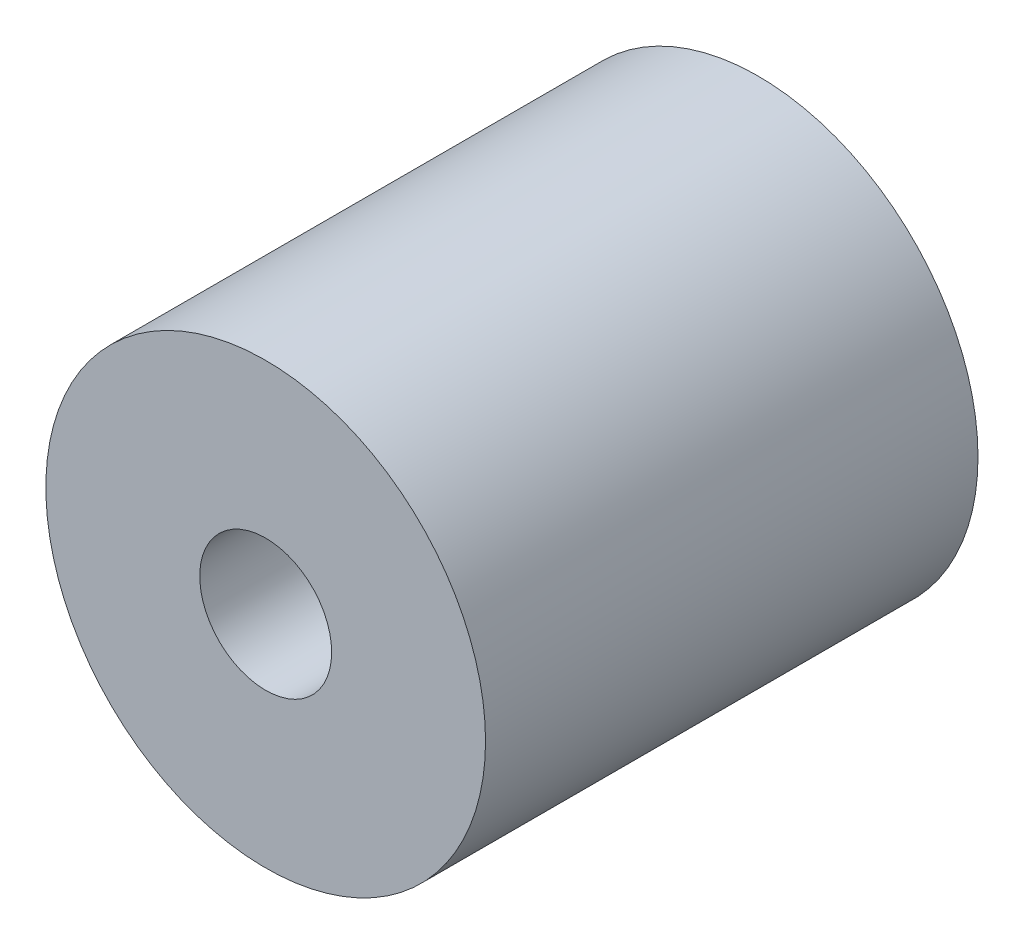
ISO-10303-21;
HEADER;
FILE_DESCRIPTION(('STEP AP214'),'2;1');
FILE_NAME('part.step','',(''),(''),'','','');
FILE_SCHEMA(('AUTOMOTIVE_DESIGN { 1 0 10303 214 1 1 1 1 }'));
ENDSEC;
DATA;
#1=APPLICATION_CONTEXT('core data for automotive mechanical design processes');
#2=APPLICATION_PROTOCOL_DEFINITION('international standard','automotive_design',2000,#1);
#3=PRODUCT_CONTEXT('',#1,'mechanical');
#4=PRODUCT('Part','Part','',(#3));
#5=PRODUCT_RELATED_PRODUCT_CATEGORY('part','',(#4));
#6=PRODUCT_DEFINITION_FORMATION('','',#4);
#7=PRODUCT_DEFINITION_CONTEXT('part definition',#1,'design');
#8=PRODUCT_DEFINITION('design','',#6,#7);
#9=PRODUCT_DEFINITION_SHAPE('','',#8);
#10=(LENGTH_UNIT() NAMED_UNIT(*) SI_UNIT(.MILLI.,.METRE.));
#11=(NAMED_UNIT(*) PLANE_ANGLE_UNIT() SI_UNIT($,.RADIAN.));
#12=(NAMED_UNIT(*) SI_UNIT($,.STERADIAN.) SOLID_ANGLE_UNIT());
#13=UNCERTAINTY_MEASURE_WITH_UNIT(LENGTH_MEASURE(1.E-05),#10,'distance_accuracy_value','');
#14=(GEOMETRIC_REPRESENTATION_CONTEXT(3) GLOBAL_UNCERTAINTY_ASSIGNED_CONTEXT((#13)) GLOBAL_UNIT_ASSIGNED_CONTEXT((#10,
#11,#12)) REPRESENTATION_CONTEXT('',''));
#15=CARTESIAN_POINT('',(0.,0.,0.));
#16=DIRECTION('',(0.,0.,1.));
#17=DIRECTION('',(1.,0.,0.));
#18=AXIS2_PLACEMENT_3D('',#15,#16,#17);
#19=CARTESIAN_POINT('',(0.,0.,17.78));
#20=DIRECTION('',(0.,0.,1.));
#21=DIRECTION('',(1.,0.,0.));
#22=AXIS2_PLACEMENT_3D('',#19,#20,#21);
#23=PLANE('',#22);
#24=CARTESIAN_POINT('',(0.,0.,17.78));
#25=DIRECTION('',(0.,0.,1.));
#26=DIRECTION('',(1.,0.,0.));
#27=AXIS2_PLACEMENT_3D('',#24,#25,#26);
#28=CIRCLE('',#27,7.9375);
#29=CARTESIAN_POINT('',(7.9375,0.,17.78));
#30=VERTEX_POINT('',#29);
#31=EDGE_CURVE('E10',#30,#30,#28,.T.);
#32=ORIENTED_EDGE('',*,*,#31,.T.);
#33=EDGE_LOOP('',(#32));
#34=FACE_BOUND('',#33,.T.);
#35=CARTESIAN_POINT('',(0.,0.,17.78));
#36=DIRECTION('',(0.,0.,1.));
#37=DIRECTION('',(1.,0.,0.));
#38=AXIS2_PLACEMENT_3D('',#35,#36,#37);
#39=CIRCLE('',#38,2.38125);
#40=CARTESIAN_POINT('',(2.38125,0.,17.78));
#41=VERTEX_POINT('',#40);
#42=EDGE_CURVE('E52',#41,#41,#39,.T.);
#43=ORIENTED_EDGE('',*,*,#42,.F.);
#44=EDGE_LOOP('',(#43));
#45=FACE_BOUND('',#44,.T.);
#46=ADVANCED_FACE('F41',(#34,#45),#23,.T.);
#47=CARTESIAN_POINT('',(0.,0.,0.));
#48=DIRECTION('',(0.,0.,1.));
#49=DIRECTION('',(1.,0.,0.));
#50=AXIS2_PLACEMENT_3D('',#47,#48,#49);
#51=PLANE('',#50);
#52=CARTESIAN_POINT('',(0.,0.,0.));
#53=DIRECTION('',(0.,0.,1.));
#54=DIRECTION('',(1.,0.,0.));
#55=AXIS2_PLACEMENT_3D('',#52,#53,#54);
#56=CIRCLE('',#55,7.9375);
#57=CARTESIAN_POINT('',(7.9375,0.,0.));
#58=VERTEX_POINT('',#57);
#59=EDGE_CURVE('E45',#58,#58,#56,.T.);
#60=ORIENTED_EDGE('',*,*,#59,.F.);
#61=EDGE_LOOP('',(#60));
#62=FACE_BOUND('',#61,.T.);
#63=CARTESIAN_POINT('',(0.,0.,0.));
#64=DIRECTION('',(0.,0.,1.));
#65=DIRECTION('',(1.,0.,0.));
#66=AXIS2_PLACEMENT_3D('',#63,#64,#65);
#67=CIRCLE('',#66,2.38125);
#68=CARTESIAN_POINT('',(2.38125,0.,0.));
#69=VERTEX_POINT('',#68);
#70=EDGE_CURVE('E54',#69,#69,#67,.T.);
#71=ORIENTED_EDGE('',*,*,#70,.T.);
#72=EDGE_LOOP('',(#71));
#73=FACE_BOUND('',#72,.T.);
#74=ADVANCED_FACE('F64',(#62,#73),#51,.F.);
#75=CARTESIAN_POINT('',(0.,0.,17.78));
#76=DIRECTION('',(0.,0.,-1.));
#77=DIRECTION('',(-1.,0.,0.));
#78=AXIS2_PLACEMENT_3D('',#75,#76,#77);
#79=CYLINDRICAL_SURFACE('',#78,7.9375);
#80=ORIENTED_EDGE('',*,*,#31,.F.);
#81=EDGE_LOOP('',(#80));
#82=FACE_BOUND('',#81,.T.);
#83=ORIENTED_EDGE('',*,*,#59,.T.);
#84=EDGE_LOOP('',(#83));
#85=FACE_BOUND('',#84,.T.);
#86=ADVANCED_FACE('F43',(#82,#85),#79,.T.);
#87=CARTESIAN_POINT('',(0.,0.,17.78));
#88=DIRECTION('',(0.,0.,-1.));
#89=DIRECTION('',(-1.,0.,0.));
#90=AXIS2_PLACEMENT_3D('',#87,#88,#89);
#91=CYLINDRICAL_SURFACE('',#90,2.38125);
#92=ORIENTED_EDGE('',*,*,#42,.T.);
#93=EDGE_LOOP('',(#92));
#94=FACE_BOUND('',#93,.T.);
#95=ORIENTED_EDGE('',*,*,#70,.F.);
#96=EDGE_LOOP('',(#95));
#97=FACE_BOUND('',#96,.T.);
#98=ADVANCED_FACE('F60',(#94,#97),#91,.F.);
#99=CLOSED_SHELL('',(#46,#74,#86,#98));
#100=MANIFOLD_SOLID_BREP('B2',#99);
#101=ADVANCED_BREP_SHAPE_REPRESENTATION('',(#18,#100),#14);
#102=SHAPE_DEFINITION_REPRESENTATION(#9,#101);
ENDSEC;
END-ISO-10303-21;
